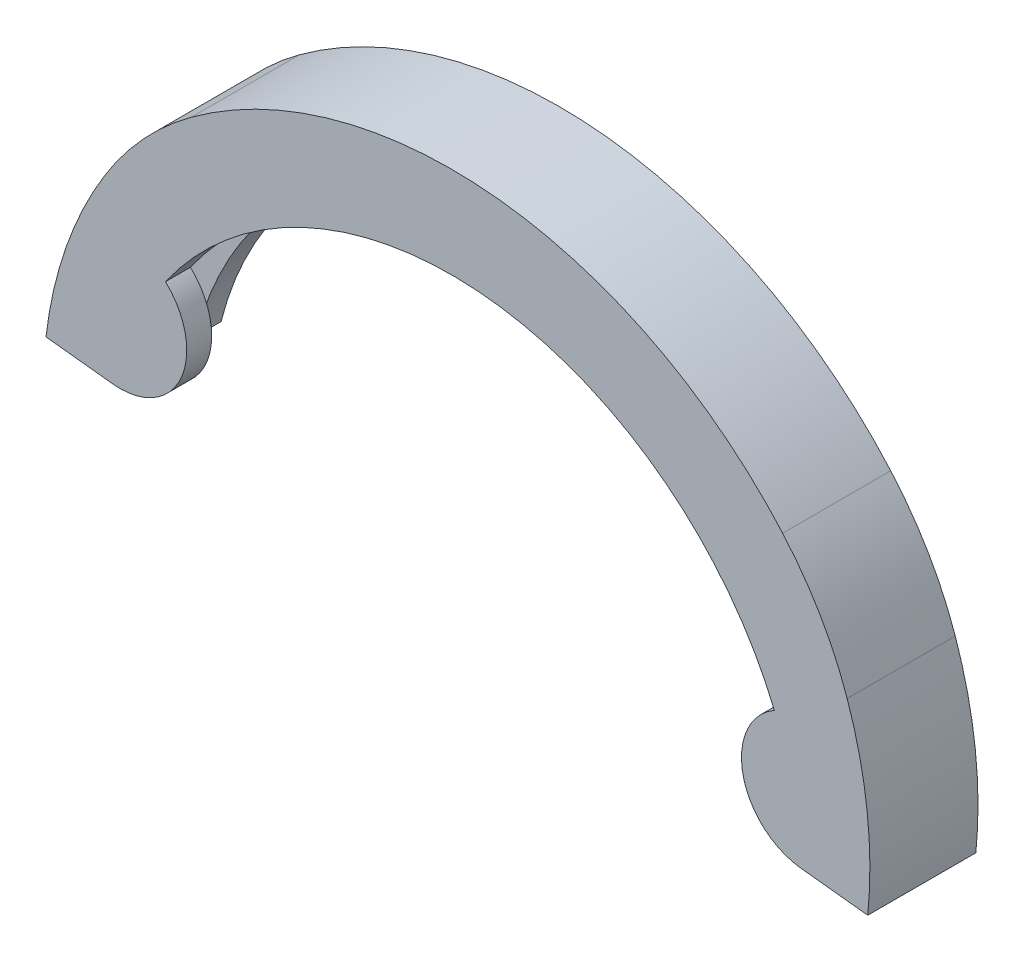
ISO-10303-21;
HEADER;
FILE_DESCRIPTION(('STEP AP214'),'2;1');
FILE_NAME('part.step','',(''),(''),'','','');
FILE_SCHEMA(('AUTOMOTIVE_DESIGN { 1 0 10303 214 1 1 1 1 }'));
ENDSEC;
DATA;
#1=APPLICATION_CONTEXT('core data for automotive mechanical design processes');
#2=APPLICATION_PROTOCOL_DEFINITION('international standard','automotive_design',2000,#1);
#3=PRODUCT_CONTEXT('',#1,'mechanical');
#4=PRODUCT('Part','Part','',(#3));
#5=PRODUCT_RELATED_PRODUCT_CATEGORY('part','',(#4));
#6=PRODUCT_DEFINITION_FORMATION('','',#4);
#7=PRODUCT_DEFINITION_CONTEXT('part definition',#1,'design');
#8=PRODUCT_DEFINITION('design','',#6,#7);
#9=PRODUCT_DEFINITION_SHAPE('','',#8);
#10=(LENGTH_UNIT() NAMED_UNIT(*) SI_UNIT(.MILLI.,.METRE.));
#11=(NAMED_UNIT(*) PLANE_ANGLE_UNIT() SI_UNIT($,.RADIAN.));
#12=(NAMED_UNIT(*) SI_UNIT($,.STERADIAN.) SOLID_ANGLE_UNIT());
#13=UNCERTAINTY_MEASURE_WITH_UNIT(LENGTH_MEASURE(1.E-05),#10,'distance_accuracy_value','');
#14=(GEOMETRIC_REPRESENTATION_CONTEXT(3) GLOBAL_UNCERTAINTY_ASSIGNED_CONTEXT((#13)) GLOBAL_UNIT_ASSIGNED_CONTEXT((#10,
#11,#12)) REPRESENTATION_CONTEXT('',''));
#15=CARTESIAN_POINT('',(0.,0.,0.));
#16=DIRECTION('',(0.,0.,1.));
#17=DIRECTION('',(1.,0.,0.));
#18=AXIS2_PLACEMENT_3D('',#15,#16,#17);
#19=CARTESIAN_POINT('',(0.,0.,0.));
#20=DIRECTION('',(0.,0.,-1.));
#21=DIRECTION('',(-1.,0.,0.));
#22=AXIS2_PLACEMENT_3D('',#19,#20,#21);
#23=CYLINDRICAL_SURFACE('',#22,53.);
#24=CARTESIAN_POINT('',(0.,0.,3.));
#25=DIRECTION('',(0.,0.,-1.));
#26=DIRECTION('',(-1.,0.,0.));
#27=AXIS2_PLACEMENT_3D('',#24,#25,#26);
#28=CIRCLE('',#27,53.);
#29=CARTESIAN_POINT('',(-31.285748838014,42.7808592672553,3.));
#30=VERTEX_POINT('',#29);
#31=CARTESIAN_POINT('',(39.803624334055,34.9953066835172,3.));
#32=VERTEX_POINT('',#31);
#33=EDGE_CURVE('E213',#30,#32,#28,.T.);
#34=ORIENTED_EDGE('',*,*,#33,.T.);
#35=DIRECTION('',(0.,0.,-1.));
#36=VECTOR('',#35,1.);
#37=CARTESIAN_POINT('',(39.803624334055,34.9953066835172,0.));
#38=LINE('',#37,#36);
#39=CARTESIAN_POINT('',(39.803624334055,34.9953066835172,-10.));
#40=VERTEX_POINT('',#39);
#41=EDGE_CURVE('E59',#32,#40,#38,.T.);
#42=ORIENTED_EDGE('',*,*,#41,.T.);
#43=CARTESIAN_POINT('',(0.,0.,-10.));
#44=DIRECTION('',(0.,0.,1.));
#45=DIRECTION('',(1.,0.,0.));
#46=AXIS2_PLACEMENT_3D('',#43,#44,#45);
#47=CIRCLE('',#46,53.);
#48=CARTESIAN_POINT('',(-31.285748838014,42.7808592672553,-10.));
#49=VERTEX_POINT('',#48);
#50=EDGE_CURVE('E172',#49,#40,#47,.F.);
#51=ORIENTED_EDGE('',*,*,#50,.F.);
#52=DIRECTION('',(0.,0.,-1.));
#53=VECTOR('',#52,1.);
#54=CARTESIAN_POINT('',(-31.285748838014,42.7808592672553,0.));
#55=LINE('',#54,#53);
#56=EDGE_CURVE('E199',#49,#30,#55,.F.);
#57=ORIENTED_EDGE('',*,*,#56,.T.);
#58=EDGE_LOOP('',(#34,#42,#51,#57));
#59=FACE_BOUND('',#58,.T.);
#60=ADVANCED_FACE('F38',(#59),#23,.T.);
#61=CARTESIAN_POINT('',(0.,0.,-10.));
#62=DIRECTION('',(0.,0.,1.));
#63=DIRECTION('',(1.,0.,0.));
#64=AXIS2_PLACEMENT_3D('',#61,#62,#63);
#65=PLANE('',#64);
#66=ORIENTED_EDGE('',*,*,#50,.T.);
#67=CARTESIAN_POINT('',(9.7631531385418,8.58375446954196,-10.));
#68=DIRECTION('',(0.,0.,1.));
#69=DIRECTION('',(1.,0.,0.));
#70=AXIS2_PLACEMENT_3D('',#67,#68,#69);
#71=CIRCLE('',#70,40.);
#72=CARTESIAN_POINT('',(47.5647084203053,21.6620731030583,-10.));
#73=VERTEX_POINT('',#72);
#74=EDGE_CURVE('E46',#40,#73,#71,.F.);
#75=ORIENTED_EDGE('',*,*,#74,.T.);
#76=CARTESIAN_POINT('',(0.592599822001633,5.41099034845242,-10.));
#77=DIRECTION('',(0.,0.,1.));
#78=DIRECTION('',(1.,0.,0.));
#79=AXIS2_PLACEMENT_3D('',#76,#77,#78);
#80=CIRCLE('',#79,49.7038899571037);
#81=CARTESIAN_POINT('',(50.0355559893201,0.324659420907119,-10.));
#82=VERTEX_POINT('',#81);
#83=EDGE_CURVE('E144',#82,#73,#80,.T.);
#84=ORIENTED_EDGE('',*,*,#83,.F.);
#85=DIRECTION('',(0.99405633822232,-0.108866874851961,0.));
#86=VECTOR('',#85,1.);
#87=CARTESIAN_POINT('',(53.,0.,-10.));
#88=LINE('',#87,#86);
#89=CARTESIAN_POINT('',(41.9826646344601,1.20659445981428,-10.));
#90=VERTEX_POINT('',#89);
#91=EDGE_CURVE('E158',#90,#82,#88,.T.);
#92=ORIENTED_EDGE('',*,*,#91,.F.);
#93=CARTESIAN_POINT('',(0.,0.,-10.));
#94=DIRECTION('',(0.,0.,-1.));
#95=DIRECTION('',(-1.,0.,0.));
#96=AXIS2_PLACEMENT_3D('',#93,#94,#95);
#97=CIRCLE('',#96,42.);
#98=CARTESIAN_POINT('',(-40.7263530118166,10.2647050789048,-10.));
#99=VERTEX_POINT('',#98);
#100=EDGE_CURVE('E208',#90,#99,#97,.F.);
#101=ORIENTED_EDGE('',*,*,#100,.T.);
#102=CARTESIAN_POINT('',(-48.7792443666767,11.146640117812,-10.));
#103=VERTEX_POINT('',#102);
#104=EDGE_CURVE('E168',#103,#99,#88,.T.);
#105=ORIENTED_EDGE('',*,*,#104,.F.);
#106=CARTESIAN_POINT('',(0.592599822001633,5.41099034845242,-10.));
#107=DIRECTION('',(0.,0.,1.));
#108=DIRECTION('',(1.,0.,0.));
#109=AXIS2_PLACEMENT_3D('',#106,#107,#108);
#110=CIRCLE('',#109,49.7038899571037);
#111=CARTESIAN_POINT('',(-41.7487041710432,31.443482604025,-10.));
#112=VERTEX_POINT('',#111);
#113=EDGE_CURVE('E190',#103,#112,#110,.F.);
#114=ORIENTED_EDGE('',*,*,#113,.T.);
#115=CARTESIAN_POINT('',(-7.67386292253174,10.4934183108362,-10.));
#116=DIRECTION('',(0.,0.,1.));
#117=DIRECTION('',(1.,0.,0.));
#118=AXIS2_PLACEMENT_3D('',#115,#116,#117);
#119=CIRCLE('',#118,40.);
#120=EDGE_CURVE('E203',#112,#49,#119,.F.);
#121=ORIENTED_EDGE('',*,*,#120,.T.);
#122=EDGE_LOOP('',(#66,#75,#84,#92,#101,#105,#114,#121));
#123=FACE_BOUND('',#122,.T.);
#124=ADVANCED_FACE('F156',(#123),#65,.F.);
#125=CARTESIAN_POINT('',(0.,0.,3.));
#126=DIRECTION('',(0.,0.,-1.));
#127=DIRECTION('',(-1.,0.,0.));
#128=AXIS2_PLACEMENT_3D('',#125,#126,#127);
#129=PLANE('',#128);
#130=CARTESIAN_POINT('',(0.592599822001633,5.41099034845242,3.));
#131=DIRECTION('',(0.,0.,1.));
#132=DIRECTION('',(1.,0.,0.));
#133=AXIS2_PLACEMENT_3D('',#130,#131,#132);
#134=CIRCLE('',#133,49.7038899571037);
#135=CARTESIAN_POINT('',(50.0355559893201,0.324659420907147,3.));
#136=VERTEX_POINT('',#135);
#137=CARTESIAN_POINT('',(47.5647084203053,21.6620731030583,3.));
#138=VERTEX_POINT('',#137);
#139=EDGE_CURVE('E147',#136,#138,#134,.T.);
#140=ORIENTED_EDGE('',*,*,#139,.T.);
#141=CARTESIAN_POINT('',(9.7631531385418,8.58375446954196,3.));
#142=DIRECTION('',(0.,0.,-1.));
#143=DIRECTION('',(-1.,0.,0.));
#144=AXIS2_PLACEMENT_3D('',#141,#142,#143);
#145=CIRCLE('',#144,40.);
#146=EDGE_CURVE('E197',#138,#32,#145,.F.);
#147=ORIENTED_EDGE('',*,*,#146,.T.);
#148=ORIENTED_EDGE('',*,*,#33,.F.);
#149=CARTESIAN_POINT('',(-7.67386292253174,10.4934183108362,3.));
#150=DIRECTION('',(0.,0.,-1.));
#151=DIRECTION('',(-1.,0.,0.));
#152=AXIS2_PLACEMENT_3D('',#149,#150,#151);
#153=CIRCLE('',#152,40.);
#154=CARTESIAN_POINT('',(-41.7487041710432,31.443482604025,3.));
#155=VERTEX_POINT('',#154);
#156=EDGE_CURVE('E195',#30,#155,#153,.F.);
#157=ORIENTED_EDGE('',*,*,#156,.T.);
#158=CARTESIAN_POINT('',(0.592599822001633,5.41099034845242,3.));
#159=DIRECTION('',(0.,0.,1.));
#160=DIRECTION('',(1.,0.,0.));
#161=AXIS2_PLACEMENT_3D('',#158,#159,#160);
#162=CIRCLE('',#161,49.7038899571037);
#163=CARTESIAN_POINT('',(-48.7792443666766,11.146640117812,3.));
#164=VERTEX_POINT('',#163);
#165=EDGE_CURVE('E160',#164,#155,#162,.F.);
#166=ORIENTED_EDGE('',*,*,#165,.F.);
#167=DIRECTION('',(-0.99405633822232,0.108866874851961,0.));
#168=VECTOR('',#167,1.);
#169=CARTESIAN_POINT('',(-51.7436883773565,11.4712995387191,3.));
#170=LINE('',#169,#168);
#171=CARTESIAN_POINT('',(-40.7263530118166,10.2647050789048,3.));
#172=VERTEX_POINT('',#171);
#173=EDGE_CURVE('E171',#172,#164,#170,.T.);
#174=ORIENTED_EDGE('',*,*,#173,.F.);
#175=CARTESIAN_POINT('',(-39.8554180130009,18.2171557846834,3.));
#176=DIRECTION('',(0.,0.,1.));
#177=DIRECTION('',(1.,0.,0.));
#178=AXIS2_PLACEMENT_3D('',#175,#176,#177);
#179=CIRCLE('',#178,8.);
#180=CARTESIAN_POINT('',(-34.4118522596681,24.0795436846045,3.));
#181=VERTEX_POINT('',#180);
#182=EDGE_CURVE('E218',#172,#181,#179,.T.);
#183=ORIENTED_EDGE('',*,*,#182,.T.);
#184=CARTESIAN_POINT('',(0.,0.,3.));
#185=DIRECTION('',(0.,0.,-1.));
#186=DIRECTION('',(-1.,0.,0.));
#187=AXIS2_PLACEMENT_3D('',#184,#185,#186);
#188=CIRCLE('',#187,42.);
#189=CARTESIAN_POINT('',(38.8079210976164,16.0606743345721,3.));
#190=VERTEX_POINT('',#189);
#191=EDGE_CURVE('E151',#190,#181,#188,.F.);
#192=ORIENTED_EDGE('',*,*,#191,.F.);
#193=CARTESIAN_POINT('',(42.8535996332758,9.15904516559284,3.));
#194=DIRECTION('',(0.,0.,1.));
#195=DIRECTION('',(1.,0.,0.));
#196=AXIS2_PLACEMENT_3D('',#193,#194,#195);
#197=CIRCLE('',#196,8.);
#198=CARTESIAN_POINT('',(41.9826646344601,1.20659445981428,3.));
#199=VERTEX_POINT('',#198);
#200=EDGE_CURVE('E222',#190,#199,#197,.T.);
#201=ORIENTED_EDGE('',*,*,#200,.T.);
#202=EDGE_CURVE('E166',#136,#199,#170,.T.);
#203=ORIENTED_EDGE('',*,*,#202,.F.);
#204=EDGE_LOOP('',(#140,#147,#148,#157,#166,#174,#183,#192,#201,#203));
#205=FACE_BOUND('',#204,.T.);
#206=ADVANCED_FACE('F212',(#205),#129,.F.);
#207=CARTESIAN_POINT('',(-51.7436883773565,11.4712995387191,154.383627261102));
#208=DIRECTION('',(0.108866874851961,0.99405633822232,0.));
#209=DIRECTION('',(-0.99405633822232,0.108866874851961,0.));
#210=AXIS2_PLACEMENT_3D('',#207,#208,#209);
#211=PLANE('',#210);
#212=DIRECTION('',(0.,0.,-1.));
#213=VECTOR('',#212,1.);
#214=CARTESIAN_POINT('',(41.9826646344601,1.20659445981428,10.));
#215=LINE('',#214,#213);
#216=CARTESIAN_POINT('',(41.9826646344601,1.20659445981428,-7.));
#217=VERTEX_POINT('',#216);
#218=EDGE_CURVE('E165',#217,#90,#215,.T.);
#219=ORIENTED_EDGE('',*,*,#218,.T.);
#220=ORIENTED_EDGE('',*,*,#91,.T.);
#221=DIRECTION('',(0.,0.,-1.));
#222=VECTOR('',#221,1.);
#223=CARTESIAN_POINT('',(50.0355559893201,0.324659420907147,154.383627261102));
#224=LINE('',#223,#222);
#225=EDGE_CURVE('E140',#136,#82,#224,.T.);
#226=ORIENTED_EDGE('',*,*,#225,.F.);
#227=ORIENTED_EDGE('',*,*,#202,.T.);
#228=CARTESIAN_POINT('',(41.9826646344601,1.20659445981428,0.));
#229=VERTEX_POINT('',#228);
#230=EDGE_CURVE('E169',#199,#229,#215,.T.);
#231=ORIENTED_EDGE('',*,*,#230,.T.);
#232=DIRECTION('',(0.99405633822232,-0.108866874851961,0.));
#233=VECTOR('',#232,1.);
#234=CARTESIAN_POINT('',(0.62815581132173,5.73564976935956,0.));
#235=LINE('',#234,#233);
#236=CARTESIAN_POINT('',(49.9989197371834,0.328671743069433,0.));
#237=VERTEX_POINT('',#236);
#238=EDGE_CURVE('E241',#229,#237,#235,.T.);
#239=ORIENTED_EDGE('',*,*,#238,.T.);
#240=DIRECTION('',(0.,0.,-1.));
#241=VECTOR('',#240,1.);
#242=CARTESIAN_POINT('',(49.9989197371834,0.328671743069432,0.));
#243=LINE('',#242,#241);
#244=CARTESIAN_POINT('',(49.9989197371834,0.328671743069432,-7.));
#245=VERTEX_POINT('',#244);
#246=EDGE_CURVE('E238',#237,#245,#243,.T.);
#247=ORIENTED_EDGE('',*,*,#246,.T.);
#248=DIRECTION('',(-0.99405633822232,0.108866874851961,0.));
#249=VECTOR('',#248,1.);
#250=CARTESIAN_POINT('',(0.628155811321729,5.73564976935956,-7.));
#251=LINE('',#250,#249);
#252=EDGE_CURVE('E183',#245,#217,#251,.T.);
#253=ORIENTED_EDGE('',*,*,#252,.T.);
#254=EDGE_LOOP('',(#219,#220,#226,#227,#231,#239,#247,#253));
#255=FACE_BOUND('',#254,.T.);
#256=ADVANCED_FACE('F163',(#255),#211,.F.);
#257=DIRECTION('',(0.,0.,-1.));
#258=VECTOR('',#257,1.);
#259=CARTESIAN_POINT('',(-40.7263530118166,10.2647050789048,10.));
#260=LINE('',#259,#258);
#261=CARTESIAN_POINT('',(-40.7263530118166,10.2647050789048,0.));
#262=VERTEX_POINT('',#261);
#263=EDGE_CURVE('E246',#172,#262,#260,.T.);
#264=ORIENTED_EDGE('',*,*,#263,.F.);
#265=ORIENTED_EDGE('',*,*,#173,.T.);
#266=DIRECTION('',(0.,0.,-1.));
#267=VECTOR('',#266,1.);
#268=CARTESIAN_POINT('',(-48.7792443666766,11.146640117812,154.383627261102));
#269=LINE('',#268,#267);
#270=EDGE_CURVE('E177',#164,#103,#269,.T.);
#271=ORIENTED_EDGE('',*,*,#270,.T.);
#272=ORIENTED_EDGE('',*,*,#104,.T.);
#273=CARTESIAN_POINT('',(-40.7263530118166,10.2647050789048,-7.));
#274=VERTEX_POINT('',#273);
#275=EDGE_CURVE('E250',#274,#99,#260,.T.);
#276=ORIENTED_EDGE('',*,*,#275,.F.);
#277=CARTESIAN_POINT('',(-48.7426081145399,11.1426277956497,-7.));
#278=VERTEX_POINT('',#277);
#279=EDGE_CURVE('E176',#274,#278,#251,.T.);
#280=ORIENTED_EDGE('',*,*,#279,.T.);
#281=DIRECTION('',(0.,0.,-1.));
#282=VECTOR('',#281,1.);
#283=CARTESIAN_POINT('',(-48.7426081145399,11.1426277956497,0.));
#284=LINE('',#283,#282);
#285=CARTESIAN_POINT('',(-48.7426081145399,11.1426277956497,0.));
#286=VERTEX_POINT('',#285);
#287=EDGE_CURVE('E182',#278,#286,#284,.F.);
#288=ORIENTED_EDGE('',*,*,#287,.T.);
#289=EDGE_CURVE('E244',#286,#262,#235,.T.);
#290=ORIENTED_EDGE('',*,*,#289,.T.);
#291=EDGE_LOOP('',(#264,#265,#271,#272,#276,#280,#288,#290));
#292=FACE_BOUND('',#291,.T.);
#293=ADVANCED_FACE('F262',(#292),#211,.F.);
#294=CARTESIAN_POINT('',(0.,0.,-7.));
#295=DIRECTION('',(0.,0.,1.));
#296=DIRECTION('',(1.,0.,0.));
#297=AXIS2_PLACEMENT_3D('',#294,#295,#296);
#298=PLANE('',#297);
#299=ORIENTED_EDGE('',*,*,#279,.F.);
#300=CARTESIAN_POINT('',(0.,0.,-7.));
#301=DIRECTION('',(0.,0.,1.));
#302=DIRECTION('',(1.,0.,0.));
#303=AXIS2_PLACEMENT_3D('',#300,#301,#302);
#304=CIRCLE('',#303,42.);
#305=EDGE_CURVE('E233',#274,#217,#304,.F.);
#306=ORIENTED_EDGE('',*,*,#305,.T.);
#307=ORIENTED_EDGE('',*,*,#252,.F.);
#308=CARTESIAN_POINT('',(0.,0.,-7.));
#309=DIRECTION('',(0.,0.,-1.));
#310=DIRECTION('',(-1.,0.,0.));
#311=AXIS2_PLACEMENT_3D('',#308,#309,#310);
#312=CIRCLE('',#311,50.);
#313=EDGE_CURVE('E152',#278,#245,#312,.T.);
#314=ORIENTED_EDGE('',*,*,#313,.F.);
#315=EDGE_LOOP('',(#299,#306,#307,#314));
#316=FACE_BOUND('',#315,.T.);
#317=ADVANCED_FACE('F256',(#316),#298,.T.);
#318=CARTESIAN_POINT('',(0.,0.,0.));
#319=DIRECTION('',(0.,0.,-1.));
#320=DIRECTION('',(-1.,0.,0.));
#321=AXIS2_PLACEMENT_3D('',#318,#319,#320);
#322=PLANE('',#321);
#323=CARTESIAN_POINT('',(0.,0.,0.));
#324=DIRECTION('',(0.,0.,-1.));
#325=DIRECTION('',(-1.,0.,0.));
#326=AXIS2_PLACEMENT_3D('',#323,#324,#325);
#327=CIRCLE('',#326,50.);
#328=EDGE_CURVE('E232',#286,#237,#327,.T.);
#329=ORIENTED_EDGE('',*,*,#328,.T.);
#330=ORIENTED_EDGE('',*,*,#238,.F.);
#331=CARTESIAN_POINT('',(42.8535996332758,9.15904516559284,0.));
#332=DIRECTION('',(0.,0.,1.));
#333=DIRECTION('',(1.,0.,0.));
#334=AXIS2_PLACEMENT_3D('',#331,#332,#333);
#335=CIRCLE('',#334,8.);
#336=CARTESIAN_POINT('',(38.8079210976164,16.0606743345721,0.));
#337=VERTEX_POINT('',#336);
#338=EDGE_CURVE('E224',#337,#229,#335,.T.);
#339=ORIENTED_EDGE('',*,*,#338,.F.);
#340=CARTESIAN_POINT('',(0.,0.,0.));
#341=DIRECTION('',(0.,0.,-1.));
#342=DIRECTION('',(-1.,0.,0.));
#343=AXIS2_PLACEMENT_3D('',#340,#341,#342);
#344=CIRCLE('',#343,42.);
#345=CARTESIAN_POINT('',(-34.4118522596681,24.0795436846045,0.));
#346=VERTEX_POINT('',#345);
#347=EDGE_CURVE('E229',#337,#346,#344,.F.);
#348=ORIENTED_EDGE('',*,*,#347,.T.);
#349=CARTESIAN_POINT('',(-39.8554180130009,18.2171557846834,0.));
#350=DIRECTION('',(0.,0.,1.));
#351=DIRECTION('',(1.,0.,0.));
#352=AXIS2_PLACEMENT_3D('',#349,#350,#351);
#353=CIRCLE('',#352,8.);
#354=EDGE_CURVE('E215',#262,#346,#353,.T.);
#355=ORIENTED_EDGE('',*,*,#354,.F.);
#356=ORIENTED_EDGE('',*,*,#289,.F.);
#357=EDGE_LOOP('',(#329,#330,#339,#348,#355,#356));
#358=FACE_BOUND('',#357,.T.);
#359=ADVANCED_FACE('F276',(#358),#322,.T.);
#360=CARTESIAN_POINT('',(0.,0.,0.));
#361=DIRECTION('',(0.,0.,-1.));
#362=DIRECTION('',(-1.,0.,0.));
#363=AXIS2_PLACEMENT_3D('',#360,#361,#362);
#364=CYLINDRICAL_SURFACE('',#363,50.);
#365=ORIENTED_EDGE('',*,*,#246,.F.);
#366=ORIENTED_EDGE('',*,*,#328,.F.);
#367=ORIENTED_EDGE('',*,*,#287,.F.);
#368=ORIENTED_EDGE('',*,*,#313,.T.);
#369=EDGE_LOOP('',(#365,#366,#367,#368));
#370=FACE_BOUND('',#369,.T.);
#371=ADVANCED_FACE('F259',(#370),#364,.F.);
#372=CARTESIAN_POINT('',(0.,0.,10.));
#373=DIRECTION('',(0.,0.,-1.));
#374=DIRECTION('',(-1.,0.,0.));
#375=AXIS2_PLACEMENT_3D('',#372,#373,#374);
#376=CYLINDRICAL_SURFACE('',#375,42.);
#377=DIRECTION('',(0.,0.,1.));
#378=VECTOR('',#377,1.);
#379=CARTESIAN_POINT('',(-34.4118522596681,24.0795436846045,1.5));
#380=LINE('',#379,#378);
#381=EDGE_CURVE('E188',#346,#181,#380,.T.);
#382=ORIENTED_EDGE('',*,*,#381,.F.);
#383=ORIENTED_EDGE('',*,*,#347,.F.);
#384=DIRECTION('',(0.,0.,1.));
#385=VECTOR('',#384,1.);
#386=CARTESIAN_POINT('',(38.8079210976164,16.0606743345721,1.5));
#387=LINE('',#386,#385);
#388=EDGE_CURVE('E264',#190,#337,#387,.F.);
#389=ORIENTED_EDGE('',*,*,#388,.F.);
#390=ORIENTED_EDGE('',*,*,#191,.T.);
#391=EDGE_LOOP('',(#382,#383,#389,#390));
#392=FACE_BOUND('',#391,.T.);
#393=ADVANCED_FACE('F280',(#392),#376,.F.);
#394=ORIENTED_EDGE('',*,*,#100,.F.);
#395=ORIENTED_EDGE('',*,*,#218,.F.);
#396=ORIENTED_EDGE('',*,*,#305,.F.);
#397=ORIENTED_EDGE('',*,*,#275,.T.);
#398=EDGE_LOOP('',(#394,#395,#396,#397));
#399=FACE_BOUND('',#398,.T.);
#400=ADVANCED_FACE('F291',(#399),#376,.F.);
#401=CARTESIAN_POINT('',(42.8535996332758,9.15904516559284,0.));
#402=DIRECTION('',(0.,0.,1.));
#403=DIRECTION('',(1.,0.,0.));
#404=AXIS2_PLACEMENT_3D('',#401,#402,#403);
#405=CYLINDRICAL_SURFACE('',#404,8.);
#406=ORIENTED_EDGE('',*,*,#338,.T.);
#407=ORIENTED_EDGE('',*,*,#230,.F.);
#408=ORIENTED_EDGE('',*,*,#200,.F.);
#409=ORIENTED_EDGE('',*,*,#388,.T.);
#410=EDGE_LOOP('',(#406,#407,#408,#409));
#411=FACE_BOUND('',#410,.T.);
#412=ADVANCED_FACE('F277',(#411),#405,.T.);
#413=CARTESIAN_POINT('',(-39.8554180130009,18.2171557846834,0.));
#414=DIRECTION('',(0.,0.,1.));
#415=DIRECTION('',(1.,0.,0.));
#416=AXIS2_PLACEMENT_3D('',#413,#414,#415);
#417=CYLINDRICAL_SURFACE('',#416,8.);
#418=ORIENTED_EDGE('',*,*,#354,.T.);
#419=ORIENTED_EDGE('',*,*,#381,.T.);
#420=ORIENTED_EDGE('',*,*,#182,.F.);
#421=ORIENTED_EDGE('',*,*,#263,.T.);
#422=EDGE_LOOP('',(#418,#419,#420,#421));
#423=FACE_BOUND('',#422,.T.);
#424=ADVANCED_FACE('F283',(#423),#417,.T.);
#425=CARTESIAN_POINT('',(0.592599822001633,5.41099034845242,-17.));
#426=DIRECTION('',(0.,0.,1.));
#427=DIRECTION('',(1.,0.,0.));
#428=AXIS2_PLACEMENT_3D('',#425,#426,#427);
#429=CYLINDRICAL_SURFACE('',#428,49.7038899571037);
#430=ORIENTED_EDGE('',*,*,#165,.T.);
#431=DIRECTION('',(0.,0.,1.));
#432=VECTOR('',#431,1.);
#433=CARTESIAN_POINT('',(-41.7487041710432,31.443482604025,-17.));
#434=LINE('',#433,#432);
#435=EDGE_CURVE('E11',#155,#112,#434,.F.);
#436=ORIENTED_EDGE('',*,*,#435,.T.);
#437=ORIENTED_EDGE('',*,*,#113,.F.);
#438=ORIENTED_EDGE('',*,*,#270,.F.);
#439=EDGE_LOOP('',(#430,#436,#437,#438));
#440=FACE_BOUND('',#439,.T.);
#441=ADVANCED_FACE('F214',(#440),#429,.T.);
#442=CARTESIAN_POINT('',(0.592599822001633,5.41099034845242,-17.));
#443=DIRECTION('',(0.,0.,1.));
#444=DIRECTION('',(1.,0.,0.));
#445=AXIS2_PLACEMENT_3D('',#442,#443,#444);
#446=CYLINDRICAL_SURFACE('',#445,49.7038899571037);
#447=ORIENTED_EDGE('',*,*,#83,.T.);
#448=DIRECTION('',(0.,0.,1.));
#449=VECTOR('',#448,1.);
#450=CARTESIAN_POINT('',(47.5647084203053,21.6620731030583,-17.));
#451=LINE('',#450,#449);
#452=EDGE_CURVE('E193',#73,#138,#451,.T.);
#453=ORIENTED_EDGE('',*,*,#452,.T.);
#454=ORIENTED_EDGE('',*,*,#139,.F.);
#455=ORIENTED_EDGE('',*,*,#225,.T.);
#456=EDGE_LOOP('',(#447,#453,#454,#455));
#457=FACE_BOUND('',#456,.T.);
#458=ADVANCED_FACE('F142',(#457),#446,.T.);
#459=CARTESIAN_POINT('',(9.7631531385418,8.58375446954196,0.));
#460=DIRECTION('',(0.,0.,1.));
#461=DIRECTION('',(1.,0.,0.));
#462=AXIS2_PLACEMENT_3D('',#459,#460,#461);
#463=CYLINDRICAL_SURFACE('',#462,40.);
#464=ORIENTED_EDGE('',*,*,#74,.F.);
#465=ORIENTED_EDGE('',*,*,#41,.F.);
#466=ORIENTED_EDGE('',*,*,#146,.F.);
#467=ORIENTED_EDGE('',*,*,#452,.F.);
#468=EDGE_LOOP('',(#464,#465,#466,#467));
#469=FACE_BOUND('',#468,.T.);
#470=ADVANCED_FACE('F312',(#469),#463,.T.);
#471=CARTESIAN_POINT('',(-7.67386292253174,10.4934183108362,-17.));
#472=DIRECTION('',(0.,0.,1.));
#473=DIRECTION('',(1.,0.,0.));
#474=AXIS2_PLACEMENT_3D('',#471,#472,#473);
#475=CYLINDRICAL_SURFACE('',#474,40.);
#476=ORIENTED_EDGE('',*,*,#120,.F.);
#477=ORIENTED_EDGE('',*,*,#435,.F.);
#478=ORIENTED_EDGE('',*,*,#156,.F.);
#479=ORIENTED_EDGE('',*,*,#56,.F.);
#480=EDGE_LOOP('',(#476,#477,#478,#479));
#481=FACE_BOUND('',#480,.T.);
#482=ADVANCED_FACE('F40',(#481),#475,.T.);
#483=CLOSED_SHELL('',(#60,#124,#206,#256,#293,#317,#359,#371,#393,#400,#412,#424,#441,#458,#470,#482));
#484=MANIFOLD_SOLID_BREP('B2',#483);
#485=ADVANCED_BREP_SHAPE_REPRESENTATION('',(#18,#484),#14);
#486=SHAPE_DEFINITION_REPRESENTATION(#9,#485);
ENDSEC;
END-ISO-10303-21;
